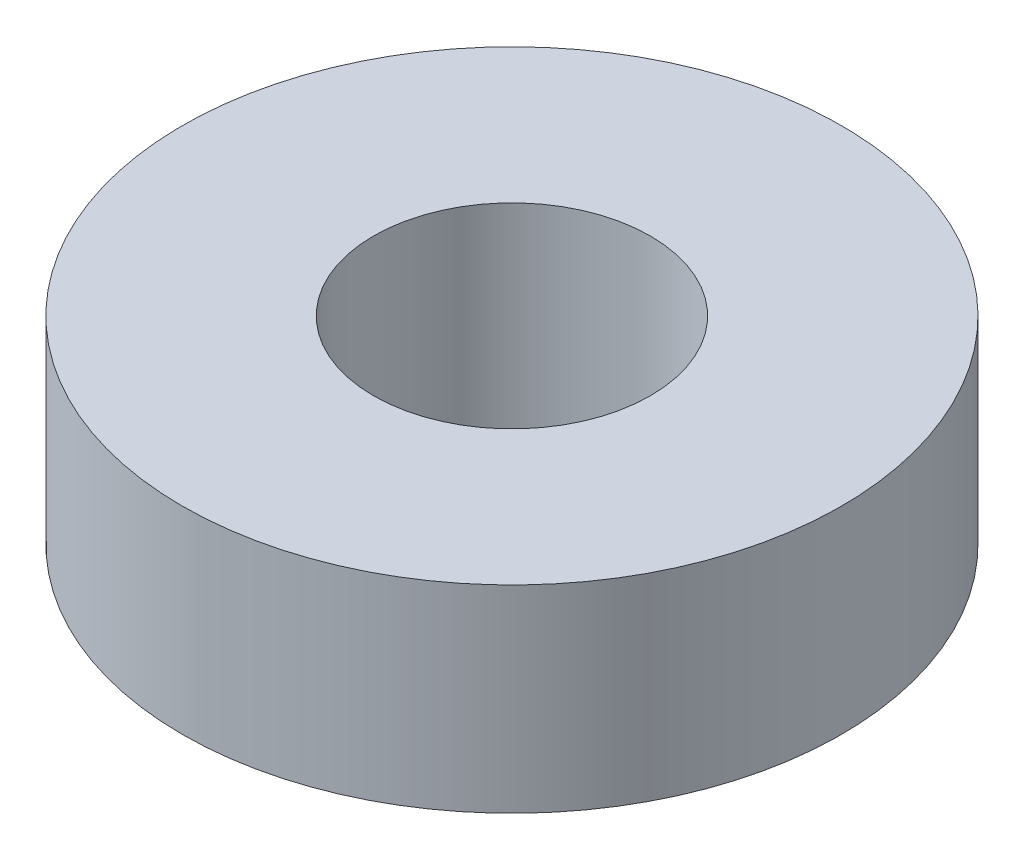
ISO-10303-21;
HEADER;
FILE_DESCRIPTION(('STEP AP214'),'2;1');
FILE_NAME('part.step','',(''),(''),'','','');
FILE_SCHEMA(('AUTOMOTIVE_DESIGN { 1 0 10303 214 1 1 1 1 }'));
ENDSEC;
DATA;
#1=APPLICATION_CONTEXT('core data for automotive mechanical design processes');
#2=APPLICATION_PROTOCOL_DEFINITION('international standard','automotive_design',2000,#1);
#3=PRODUCT_CONTEXT('',#1,'mechanical');
#4=PRODUCT('Part','Part','',(#3));
#5=PRODUCT_RELATED_PRODUCT_CATEGORY('part','',(#4));
#6=PRODUCT_DEFINITION_FORMATION('','',#4);
#7=PRODUCT_DEFINITION_CONTEXT('part definition',#1,'design');
#8=PRODUCT_DEFINITION('design','',#6,#7);
#9=PRODUCT_DEFINITION_SHAPE('','',#8);
#10=(LENGTH_UNIT() NAMED_UNIT(*) SI_UNIT(.MILLI.,.METRE.));
#11=(NAMED_UNIT(*) PLANE_ANGLE_UNIT() SI_UNIT($,.RADIAN.));
#12=(NAMED_UNIT(*) SI_UNIT($,.STERADIAN.) SOLID_ANGLE_UNIT());
#13=UNCERTAINTY_MEASURE_WITH_UNIT(LENGTH_MEASURE(1.E-05),#10,'distance_accuracy_value','');
#14=(GEOMETRIC_REPRESENTATION_CONTEXT(3) GLOBAL_UNCERTAINTY_ASSIGNED_CONTEXT((#13)) GLOBAL_UNIT_ASSIGNED_CONTEXT((#10,
#11,#12)) REPRESENTATION_CONTEXT('',''));
#15=CARTESIAN_POINT('',(0.,0.,0.));
#16=DIRECTION('',(0.,0.,1.));
#17=DIRECTION('',(1.,0.,0.));
#18=AXIS2_PLACEMENT_3D('',#15,#16,#17);
#19=CARTESIAN_POINT('',(0.,3.,0.));
#20=DIRECTION('',(0.,1.,0.));
#21=DIRECTION('',(0.,0.,1.));
#22=AXIS2_PLACEMENT_3D('',#19,#20,#21);
#23=PLANE('',#22);
#24=CARTESIAN_POINT('',(0.,3.,0.));
#25=DIRECTION('',(0.,1.,0.));
#26=DIRECTION('',(0.,0.,1.));
#27=AXIS2_PLACEMENT_3D('',#24,#25,#26);
#28=CIRCLE('',#27,5.);
#29=CARTESIAN_POINT('',(0.,3.,5.));
#30=VERTEX_POINT('',#29);
#31=EDGE_CURVE('E10',#30,#30,#28,.T.);
#32=ORIENTED_EDGE('',*,*,#31,.T.);
#33=EDGE_LOOP('',(#32));
#34=FACE_BOUND('',#33,.T.);
#35=CARTESIAN_POINT('',(0.,3.,0.));
#36=DIRECTION('',(0.,1.,0.));
#37=DIRECTION('',(0.,0.,1.));
#38=AXIS2_PLACEMENT_3D('',#35,#36,#37);
#39=CIRCLE('',#38,2.1);
#40=CARTESIAN_POINT('',(0.,3.,2.1));
#41=VERTEX_POINT('',#40);
#42=EDGE_CURVE('E56',#41,#41,#39,.T.);
#43=ORIENTED_EDGE('',*,*,#42,.F.);
#44=EDGE_LOOP('',(#43));
#45=FACE_BOUND('',#44,.T.);
#46=ADVANCED_FACE('F43',(#34,#45),#23,.T.);
#47=CARTESIAN_POINT('',(0.,0.,0.));
#48=DIRECTION('',(0.,1.,0.));
#49=DIRECTION('',(0.,0.,1.));
#50=AXIS2_PLACEMENT_3D('',#47,#48,#49);
#51=PLANE('',#50);
#52=CARTESIAN_POINT('',(0.,0.,0.));
#53=DIRECTION('',(0.,1.,0.));
#54=DIRECTION('',(0.,0.,1.));
#55=AXIS2_PLACEMENT_3D('',#52,#53,#54);
#56=CIRCLE('',#55,5.);
#57=CARTESIAN_POINT('',(0.,0.,5.));
#58=VERTEX_POINT('',#57);
#59=EDGE_CURVE('E47',#58,#58,#56,.T.);
#60=ORIENTED_EDGE('',*,*,#59,.F.);
#61=EDGE_LOOP('',(#60));
#62=FACE_BOUND('',#61,.T.);
#63=CARTESIAN_POINT('',(0.,0.,0.));
#64=DIRECTION('',(0.,1.,0.));
#65=DIRECTION('',(0.,0.,1.));
#66=AXIS2_PLACEMENT_3D('',#63,#64,#65);
#67=CIRCLE('',#66,2.1);
#68=CARTESIAN_POINT('',(0.,0.,2.1));
#69=VERTEX_POINT('',#68);
#70=EDGE_CURVE('E58',#69,#69,#67,.T.);
#71=ORIENTED_EDGE('',*,*,#70,.T.);
#72=EDGE_LOOP('',(#71));
#73=FACE_BOUND('',#72,.T.);
#74=ADVANCED_FACE('F70',(#62,#73),#51,.F.);
#75=CARTESIAN_POINT('',(0.,3.,0.));
#76=DIRECTION('',(0.,-1.,0.));
#77=DIRECTION('',(0.,0.,-1.));
#78=AXIS2_PLACEMENT_3D('',#75,#76,#77);
#79=CYLINDRICAL_SURFACE('',#78,5.);
#80=ORIENTED_EDGE('',*,*,#31,.F.);
#81=EDGE_LOOP('',(#80));
#82=FACE_BOUND('',#81,.T.);
#83=ORIENTED_EDGE('',*,*,#59,.T.);
#84=EDGE_LOOP('',(#83));
#85=FACE_BOUND('',#84,.T.);
#86=ADVANCED_FACE('F45',(#82,#85),#79,.T.);
#87=CARTESIAN_POINT('',(0.,3.,0.));
#88=DIRECTION('',(0.,-1.,0.));
#89=DIRECTION('',(0.,0.,-1.));
#90=AXIS2_PLACEMENT_3D('',#87,#88,#89);
#91=CYLINDRICAL_SURFACE('',#90,2.1);
#92=ORIENTED_EDGE('',*,*,#42,.T.);
#93=EDGE_LOOP('',(#92));
#94=FACE_BOUND('',#93,.T.);
#95=ORIENTED_EDGE('',*,*,#70,.F.);
#96=EDGE_LOOP('',(#95));
#97=FACE_BOUND('',#96,.T.);
#98=ADVANCED_FACE('F66',(#94,#97),#91,.F.);
#99=CLOSED_SHELL('',(#46,#74,#86,#98));
#100=MANIFOLD_SOLID_BREP('B2',#99);
#101=ADVANCED_BREP_SHAPE_REPRESENTATION('',(#18,#100),#14);
#102=SHAPE_DEFINITION_REPRESENTATION(#9,#101);
ENDSEC;
END-ISO-10303-21;
